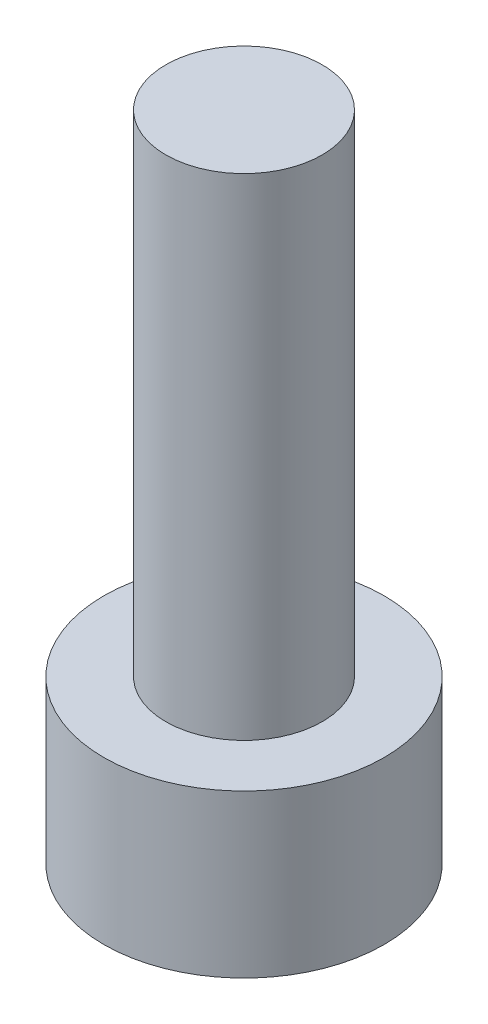
ISO-10303-21;
HEADER;
FILE_DESCRIPTION(('STEP AP214'),'2;1');
FILE_NAME('part.step','',(''),(''),'','','');
FILE_SCHEMA(('AUTOMOTIVE_DESIGN { 1 0 10303 214 1 1 1 1 }'));
ENDSEC;
DATA;
#1=APPLICATION_CONTEXT('core data for automotive mechanical design processes');
#2=APPLICATION_PROTOCOL_DEFINITION('international standard','automotive_design',2000,#1);
#3=PRODUCT_CONTEXT('',#1,'mechanical');
#4=PRODUCT('Part','Part','',(#3));
#5=PRODUCT_RELATED_PRODUCT_CATEGORY('part','',(#4));
#6=PRODUCT_DEFINITION_FORMATION('','',#4);
#7=PRODUCT_DEFINITION_CONTEXT('part definition',#1,'design');
#8=PRODUCT_DEFINITION('design','',#6,#7);
#9=PRODUCT_DEFINITION_SHAPE('','',#8);
#10=(LENGTH_UNIT() NAMED_UNIT(*) SI_UNIT(.MILLI.,.METRE.));
#11=(NAMED_UNIT(*) PLANE_ANGLE_UNIT() SI_UNIT($,.RADIAN.));
#12=(NAMED_UNIT(*) SI_UNIT($,.STERADIAN.) SOLID_ANGLE_UNIT());
#13=UNCERTAINTY_MEASURE_WITH_UNIT(LENGTH_MEASURE(1.E-05),#10,'distance_accuracy_value','');
#14=(GEOMETRIC_REPRESENTATION_CONTEXT(3) GLOBAL_UNCERTAINTY_ASSIGNED_CONTEXT((#13)) GLOBAL_UNIT_ASSIGNED_CONTEXT((#10,
#11,#12)) REPRESENTATION_CONTEXT('',''));
#15=CARTESIAN_POINT('',(0.,0.,0.));
#16=DIRECTION('',(0.,0.,1.));
#17=DIRECTION('',(1.,0.,0.));
#18=AXIS2_PLACEMENT_3D('',#15,#16,#17);
#19=CARTESIAN_POINT('',(0.,2.,0.));
#20=DIRECTION('',(0.,-1.,0.));
#21=DIRECTION('',(0.,0.,-1.));
#22=AXIS2_PLACEMENT_3D('',#19,#20,#21);
#23=CYLINDRICAL_SURFACE('',#22,1.73);
#24=CARTESIAN_POINT('',(0.,2.,0.));
#25=DIRECTION('',(0.,1.,0.));
#26=DIRECTION('',(0.,0.,1.));
#27=AXIS2_PLACEMENT_3D('',#24,#25,#26);
#28=CIRCLE('',#27,1.73);
#29=CARTESIAN_POINT('',(0.,2.,1.73));
#30=VERTEX_POINT('',#29);
#31=EDGE_CURVE('E45',#30,#30,#28,.T.);
#32=ORIENTED_EDGE('',*,*,#31,.F.);
#33=EDGE_LOOP('',(#32));
#34=FACE_BOUND('',#33,.T.);
#35=CARTESIAN_POINT('',(0.,0.,0.));
#36=DIRECTION('',(0.,1.,0.));
#37=DIRECTION('',(0.,0.,1.));
#38=AXIS2_PLACEMENT_3D('',#35,#36,#37);
#39=CIRCLE('',#38,1.73);
#40=CARTESIAN_POINT('',(0.,0.,1.73));
#41=VERTEX_POINT('',#40);
#42=EDGE_CURVE('E40',#41,#41,#39,.T.);
#43=ORIENTED_EDGE('',*,*,#42,.T.);
#44=EDGE_LOOP('',(#43));
#45=FACE_BOUND('',#44,.T.);
#46=ADVANCED_FACE('F37',(#34,#45),#23,.T.);
#47=CARTESIAN_POINT('',(0.,2.,0.));
#48=DIRECTION('',(0.,1.,0.));
#49=DIRECTION('',(0.,0.,1.));
#50=AXIS2_PLACEMENT_3D('',#47,#48,#49);
#51=PLANE('',#50);
#52=CARTESIAN_POINT('',(0.,2.,0.));
#53=DIRECTION('',(0.,1.,0.));
#54=DIRECTION('',(0.,0.,1.));
#55=AXIS2_PLACEMENT_3D('',#52,#53,#54);
#56=CIRCLE('',#55,0.965);
#57=CARTESIAN_POINT('',(0.,2.,0.965));
#58=VERTEX_POINT('',#57);
#59=EDGE_CURVE('E10',#58,#58,#56,.T.);
#60=ORIENTED_EDGE('',*,*,#59,.F.);
#61=EDGE_LOOP('',(#60));
#62=FACE_BOUND('',#61,.T.);
#63=ORIENTED_EDGE('',*,*,#31,.T.);
#64=EDGE_LOOP('',(#63));
#65=FACE_BOUND('',#64,.T.);
#66=ADVANCED_FACE('F65',(#62,#65),#51,.T.);
#67=CARTESIAN_POINT('',(0.,0.,0.));
#68=DIRECTION('',(0.,1.,0.));
#69=DIRECTION('',(0.,0.,1.));
#70=AXIS2_PLACEMENT_3D('',#67,#68,#69);
#71=PLANE('',#70);
#72=ORIENTED_EDGE('',*,*,#42,.F.);
#73=EDGE_LOOP('',(#72));
#74=FACE_BOUND('',#73,.T.);
#75=ADVANCED_FACE('F62',(#74),#71,.F.);
#76=CARTESIAN_POINT('',(0.,8.06,0.));
#77=DIRECTION('',(0.,-1.,0.));
#78=DIRECTION('',(0.,0.,-1.));
#79=AXIS2_PLACEMENT_3D('',#76,#77,#78);
#80=CYLINDRICAL_SURFACE('',#79,0.965);
#81=CARTESIAN_POINT('',(0.,8.06,0.));
#82=DIRECTION('',(0.,1.,0.));
#83=DIRECTION('',(0.,0.,1.));
#84=AXIS2_PLACEMENT_3D('',#81,#82,#83);
#85=CIRCLE('',#84,0.965);
#86=CARTESIAN_POINT('',(0.,8.06,0.965));
#87=VERTEX_POINT('',#86);
#88=EDGE_CURVE('E52',#87,#87,#85,.T.);
#89=ORIENTED_EDGE('',*,*,#88,.F.);
#90=EDGE_LOOP('',(#89));
#91=FACE_BOUND('',#90,.T.);
#92=ORIENTED_EDGE('',*,*,#59,.T.);
#93=EDGE_LOOP('',(#92));
#94=FACE_BOUND('',#93,.T.);
#95=ADVANCED_FACE('F64',(#91,#94),#80,.T.);
#96=CARTESIAN_POINT('',(0.,8.06,0.));
#97=DIRECTION('',(0.,1.,0.));
#98=DIRECTION('',(0.,0.,1.));
#99=AXIS2_PLACEMENT_3D('',#96,#97,#98);
#100=PLANE('',#99);
#101=ORIENTED_EDGE('',*,*,#88,.T.);
#102=EDGE_LOOP('',(#101));
#103=FACE_BOUND('',#102,.T.);
#104=ADVANCED_FACE('F70',(#103),#100,.T.);
#105=CLOSED_SHELL('',(#46,#66,#75,#95,#104));
#106=MANIFOLD_SOLID_BREP('B2',#105);
#107=ADVANCED_BREP_SHAPE_REPRESENTATION('',(#18,#106),#14);
#108=SHAPE_DEFINITION_REPRESENTATION(#9,#107);
ENDSEC;
END-ISO-10303-21;
